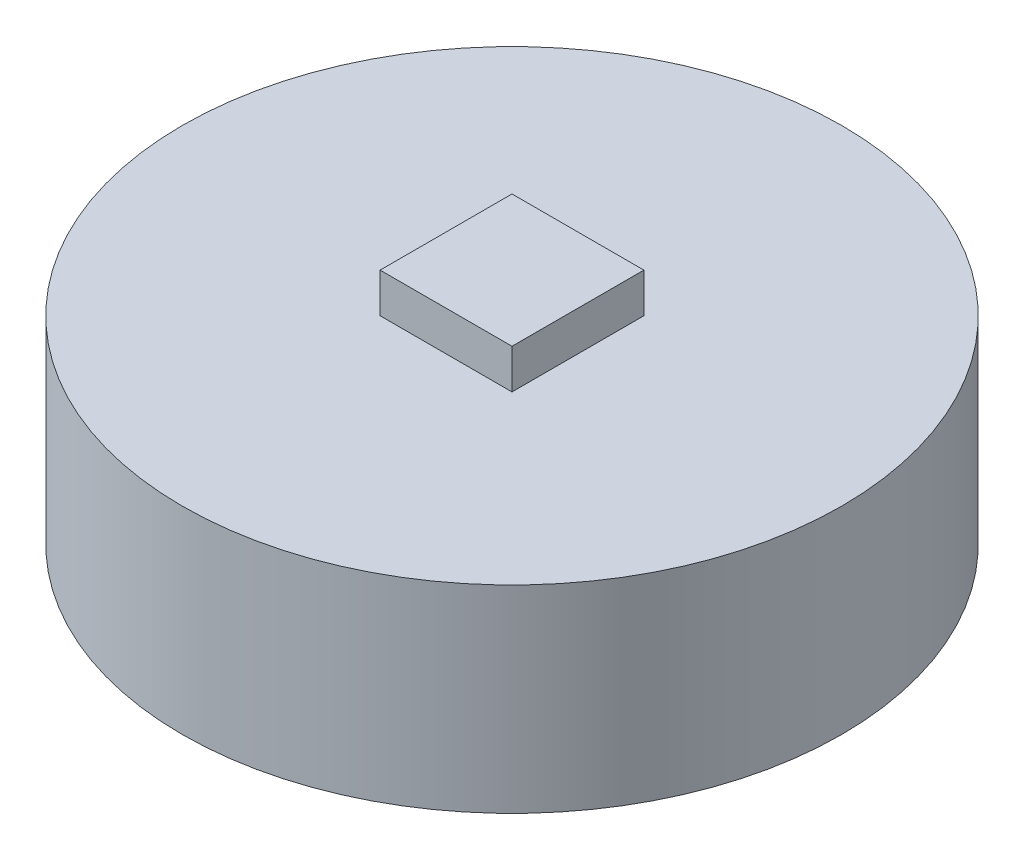
ISO-10303-21;
HEADER;
FILE_DESCRIPTION(('STEP AP214'),'2;1');
FILE_NAME('part.step','',(''),(''),'','','');
FILE_SCHEMA(('AUTOMOTIVE_DESIGN { 1 0 10303 214 1 1 1 1 }'));
ENDSEC;
DATA;
#1=APPLICATION_CONTEXT('core data for automotive mechanical design processes');
#2=APPLICATION_PROTOCOL_DEFINITION('international standard','automotive_design',2000,#1);
#3=PRODUCT_CONTEXT('',#1,'mechanical');
#4=PRODUCT('Part','Part','',(#3));
#5=PRODUCT_RELATED_PRODUCT_CATEGORY('part','',(#4));
#6=PRODUCT_DEFINITION_FORMATION('','',#4);
#7=PRODUCT_DEFINITION_CONTEXT('part definition',#1,'design');
#8=PRODUCT_DEFINITION('design','',#6,#7);
#9=PRODUCT_DEFINITION_SHAPE('','',#8);
#10=(LENGTH_UNIT() NAMED_UNIT(*) SI_UNIT(.MILLI.,.METRE.));
#11=(NAMED_UNIT(*) PLANE_ANGLE_UNIT() SI_UNIT($,.RADIAN.));
#12=(NAMED_UNIT(*) SI_UNIT($,.STERADIAN.) SOLID_ANGLE_UNIT());
#13=UNCERTAINTY_MEASURE_WITH_UNIT(LENGTH_MEASURE(1.E-05),#10,'distance_accuracy_value','');
#14=(GEOMETRIC_REPRESENTATION_CONTEXT(3) GLOBAL_UNCERTAINTY_ASSIGNED_CONTEXT((#13)) GLOBAL_UNIT_ASSIGNED_CONTEXT((#10,
#11,#12)) REPRESENTATION_CONTEXT('',''));
#15=CARTESIAN_POINT('',(0.,0.,0.));
#16=DIRECTION('',(0.,0.,1.));
#17=DIRECTION('',(1.,0.,0.));
#18=AXIS2_PLACEMENT_3D('',#15,#16,#17);
#19=CARTESIAN_POINT('',(0.,15.,0.));
#20=DIRECTION('',(0.,-1.,0.));
#21=DIRECTION('',(0.,0.,-1.));
#22=AXIS2_PLACEMENT_3D('',#19,#20,#21);
#23=CYLINDRICAL_SURFACE('',#22,25.);
#24=CARTESIAN_POINT('',(0.,15.,0.));
#25=DIRECTION('',(0.,1.,0.));
#26=DIRECTION('',(0.,0.,1.));
#27=AXIS2_PLACEMENT_3D('',#24,#25,#26);
#28=CIRCLE('',#27,25.);
#29=CARTESIAN_POINT('',(0.,15.,25.));
#30=VERTEX_POINT('',#29);
#31=EDGE_CURVE('E11',#30,#30,#28,.T.);
#32=ORIENTED_EDGE('',*,*,#31,.F.);
#33=EDGE_LOOP('',(#32));
#34=FACE_BOUND('',#33,.T.);
#35=CARTESIAN_POINT('',(0.,0.,0.));
#36=DIRECTION('',(0.,1.,0.));
#37=DIRECTION('',(0.,0.,1.));
#38=AXIS2_PLACEMENT_3D('',#35,#36,#37);
#39=CIRCLE('',#38,25.);
#40=CARTESIAN_POINT('',(0.,0.,25.));
#41=VERTEX_POINT('',#40);
#42=EDGE_CURVE('E42',#41,#41,#39,.T.);
#43=ORIENTED_EDGE('',*,*,#42,.T.);
#44=EDGE_LOOP('',(#43));
#45=FACE_BOUND('',#44,.T.);
#46=ADVANCED_FACE('F39',(#34,#45),#23,.T.);
#47=CARTESIAN_POINT('',(0.,15.,0.));
#48=DIRECTION('',(0.,1.,0.));
#49=DIRECTION('',(0.,0.,1.));
#50=AXIS2_PLACEMENT_3D('',#47,#48,#49);
#51=PLANE('',#50);
#52=DIRECTION('',(0.,0.,-1.));
#53=VECTOR('',#52,1.);
#54=CARTESIAN_POINT('',(5.,15.,5.));
#55=LINE('',#54,#53);
#56=CARTESIAN_POINT('',(5.,15.,5.));
#57=VERTEX_POINT('',#56);
#58=CARTESIAN_POINT('',(5.,15.,-5.));
#59=VERTEX_POINT('',#58);
#60=EDGE_CURVE('E62',#57,#59,#55,.T.);
#61=ORIENTED_EDGE('',*,*,#60,.F.);
#62=DIRECTION('',(1.,0.,0.));
#63=VECTOR('',#62,1.);
#64=CARTESIAN_POINT('',(-5.,15.,5.));
#65=LINE('',#64,#63);
#66=CARTESIAN_POINT('',(-5.,15.,5.));
#67=VERTEX_POINT('',#66);
#68=EDGE_CURVE('E159',#67,#57,#65,.T.);
#69=ORIENTED_EDGE('',*,*,#68,.F.);
#70=DIRECTION('',(0.,0.,1.));
#71=VECTOR('',#70,1.);
#72=CARTESIAN_POINT('',(-5.,15.,5.));
#73=LINE('',#72,#71);
#74=CARTESIAN_POINT('',(-5.,15.,-5.));
#75=VERTEX_POINT('',#74);
#76=EDGE_CURVE('E175',#75,#67,#73,.T.);
#77=ORIENTED_EDGE('',*,*,#76,.F.);
#78=DIRECTION('',(-1.,0.,0.));
#79=VECTOR('',#78,1.);
#80=CARTESIAN_POINT('',(-5.,15.,-5.));
#81=LINE('',#80,#79);
#82=EDGE_CURVE('E171',#59,#75,#81,.T.);
#83=ORIENTED_EDGE('',*,*,#82,.F.);
#84=EDGE_LOOP('',(#61,#69,#77,#83));
#85=FACE_BOUND('',#84,.T.);
#86=ORIENTED_EDGE('',*,*,#31,.T.);
#87=EDGE_LOOP('',(#86));
#88=FACE_BOUND('',#87,.T.);
#89=ADVANCED_FACE('F205',(#85,#88),#51,.T.);
#90=CARTESIAN_POINT('',(0.,0.,0.));
#91=DIRECTION('',(0.,1.,0.));
#92=DIRECTION('',(0.,0.,1.));
#93=AXIS2_PLACEMENT_3D('',#90,#91,#92);
#94=PLANE('',#93);
#95=DIRECTION('',(1.,0.,0.));
#96=VECTOR('',#95,1.);
#97=CARTESIAN_POINT('',(5.,0.,-5.));
#98=LINE('',#97,#96);
#99=CARTESIAN_POINT('',(-5.,0.,-5.));
#100=VERTEX_POINT('',#99);
#101=CARTESIAN_POINT('',(5.,0.,-5.));
#102=VERTEX_POINT('',#101);
#103=EDGE_CURVE('E140',#100,#102,#98,.T.);
#104=ORIENTED_EDGE('',*,*,#103,.F.);
#105=DIRECTION('',(0.,0.,-1.));
#106=VECTOR('',#105,1.);
#107=CARTESIAN_POINT('',(-5.,0.,5.));
#108=LINE('',#107,#106);
#109=CARTESIAN_POINT('',(-5.,0.,5.));
#110=VERTEX_POINT('',#109);
#111=EDGE_CURVE('E54',#110,#100,#108,.T.);
#112=ORIENTED_EDGE('',*,*,#111,.F.);
#113=DIRECTION('',(-1.,0.,0.));
#114=VECTOR('',#113,1.);
#115=CARTESIAN_POINT('',(5.,0.,5.));
#116=LINE('',#115,#114);
#117=CARTESIAN_POINT('',(5.,0.,5.));
#118=VERTEX_POINT('',#117);
#119=EDGE_CURVE('E127',#118,#110,#116,.T.);
#120=ORIENTED_EDGE('',*,*,#119,.F.);
#121=DIRECTION('',(0.,0.,1.));
#122=VECTOR('',#121,1.);
#123=CARTESIAN_POINT('',(5.,0.,5.));
#124=LINE('',#123,#122);
#125=EDGE_CURVE('E131',#102,#118,#124,.T.);
#126=ORIENTED_EDGE('',*,*,#125,.F.);
#127=EDGE_LOOP('',(#104,#112,#120,#126));
#128=FACE_BOUND('',#127,.T.);
#129=ORIENTED_EDGE('',*,*,#42,.F.);
#130=EDGE_LOOP('',(#129));
#131=FACE_BOUND('',#130,.T.);
#132=ADVANCED_FACE('F202',(#128,#131),#94,.F.);
#133=CARTESIAN_POINT('',(5.,18.,5.));
#134=DIRECTION('',(-1.,0.,0.));
#135=DIRECTION('',(0.,0.,1.));
#136=AXIS2_PLACEMENT_3D('',#133,#134,#135);
#137=PLANE('',#136);
#138=ORIENTED_EDGE('',*,*,#60,.T.);
#139=DIRECTION('',(0.,-1.,0.));
#140=VECTOR('',#139,1.);
#141=CARTESIAN_POINT('',(5.,18.,-5.));
#142=LINE('',#141,#140);
#143=CARTESIAN_POINT('',(5.,18.,-5.));
#144=VERTEX_POINT('',#143);
#145=EDGE_CURVE('E192',#144,#59,#142,.T.);
#146=ORIENTED_EDGE('',*,*,#145,.F.);
#147=DIRECTION('',(0.,0.,-1.));
#148=VECTOR('',#147,1.);
#149=CARTESIAN_POINT('',(5.,18.,5.));
#150=LINE('',#149,#148);
#151=CARTESIAN_POINT('',(5.,18.,5.));
#152=VERTEX_POINT('',#151);
#153=EDGE_CURVE('E154',#152,#144,#150,.T.);
#154=ORIENTED_EDGE('',*,*,#153,.F.);
#155=DIRECTION('',(0.,-1.,0.));
#156=VECTOR('',#155,1.);
#157=CARTESIAN_POINT('',(5.,18.,5.));
#158=LINE('',#157,#156);
#159=EDGE_CURVE('E168',#152,#57,#158,.T.);
#160=ORIENTED_EDGE('',*,*,#159,.T.);
#161=EDGE_LOOP('',(#138,#146,#154,#160));
#162=FACE_BOUND('',#161,.T.);
#163=ADVANCED_FACE('F204',(#162),#137,.F.);
#164=CARTESIAN_POINT('',(-5.,18.,-5.));
#165=DIRECTION('',(0.,0.,1.));
#166=DIRECTION('',(1.,0.,0.));
#167=AXIS2_PLACEMENT_3D('',#164,#165,#166);
#168=PLANE('',#167);
#169=ORIENTED_EDGE('',*,*,#82,.T.);
#170=DIRECTION('',(0.,-1.,0.));
#171=VECTOR('',#170,1.);
#172=CARTESIAN_POINT('',(-5.,18.,-5.));
#173=LINE('',#172,#171);
#174=CARTESIAN_POINT('',(-5.,18.,-5.));
#175=VERTEX_POINT('',#174);
#176=EDGE_CURVE('E188',#175,#75,#173,.T.);
#177=ORIENTED_EDGE('',*,*,#176,.F.);
#178=DIRECTION('',(-1.,0.,0.));
#179=VECTOR('',#178,1.);
#180=CARTESIAN_POINT('',(-5.,18.,-5.));
#181=LINE('',#180,#179);
#182=EDGE_CURVE('E158',#144,#175,#181,.T.);
#183=ORIENTED_EDGE('',*,*,#182,.F.);
#184=ORIENTED_EDGE('',*,*,#145,.T.);
#185=EDGE_LOOP('',(#169,#177,#183,#184));
#186=FACE_BOUND('',#185,.T.);
#187=ADVANCED_FACE('F211',(#186),#168,.F.);
#188=CARTESIAN_POINT('',(-5.,18.,5.));
#189=DIRECTION('',(1.,0.,0.));
#190=DIRECTION('',(0.,0.,-1.));
#191=AXIS2_PLACEMENT_3D('',#188,#189,#190);
#192=PLANE('',#191);
#193=ORIENTED_EDGE('',*,*,#76,.T.);
#194=DIRECTION('',(0.,-1.,0.));
#195=VECTOR('',#194,1.);
#196=CARTESIAN_POINT('',(-5.,18.,5.));
#197=LINE('',#196,#195);
#198=CARTESIAN_POINT('',(-5.,18.,5.));
#199=VERTEX_POINT('',#198);
#200=EDGE_CURVE('E184',#199,#67,#197,.T.);
#201=ORIENTED_EDGE('',*,*,#200,.F.);
#202=DIRECTION('',(0.,0.,1.));
#203=VECTOR('',#202,1.);
#204=CARTESIAN_POINT('',(-5.,18.,5.));
#205=LINE('',#204,#203);
#206=EDGE_CURVE('E162',#175,#199,#205,.T.);
#207=ORIENTED_EDGE('',*,*,#206,.F.);
#208=ORIENTED_EDGE('',*,*,#176,.T.);
#209=EDGE_LOOP('',(#193,#201,#207,#208));
#210=FACE_BOUND('',#209,.T.);
#211=ADVANCED_FACE('F241',(#210),#192,.F.);
#212=CARTESIAN_POINT('',(-5.,18.,5.));
#213=DIRECTION('',(0.,0.,-1.));
#214=DIRECTION('',(-1.,0.,0.));
#215=AXIS2_PLACEMENT_3D('',#212,#213,#214);
#216=PLANE('',#215);
#217=ORIENTED_EDGE('',*,*,#68,.T.);
#218=ORIENTED_EDGE('',*,*,#159,.F.);
#219=DIRECTION('',(1.,0.,0.));
#220=VECTOR('',#219,1.);
#221=CARTESIAN_POINT('',(-5.,18.,5.));
#222=LINE('',#221,#220);
#223=EDGE_CURVE('E165',#199,#152,#222,.T.);
#224=ORIENTED_EDGE('',*,*,#223,.F.);
#225=ORIENTED_EDGE('',*,*,#200,.T.);
#226=EDGE_LOOP('',(#217,#218,#224,#225));
#227=FACE_BOUND('',#226,.T.);
#228=ADVANCED_FACE('F250',(#227),#216,.F.);
#229=CARTESIAN_POINT('',(0.,18.,0.));
#230=DIRECTION('',(0.,-1.,0.));
#231=DIRECTION('',(0.,0.,-1.));
#232=AXIS2_PLACEMENT_3D('',#229,#230,#231);
#233=PLANE('',#232);
#234=ORIENTED_EDGE('',*,*,#153,.T.);
#235=ORIENTED_EDGE('',*,*,#182,.T.);
#236=ORIENTED_EDGE('',*,*,#206,.T.);
#237=ORIENTED_EDGE('',*,*,#223,.T.);
#238=EDGE_LOOP('',(#234,#235,#236,#237));
#239=FACE_BOUND('',#238,.T.);
#240=ADVANCED_FACE('F260',(#239),#233,.F.);
#241=CARTESIAN_POINT('',(-5.,3.,5.));
#242=DIRECTION('',(-1.,0.,0.));
#243=DIRECTION('',(0.,0.,1.));
#244=AXIS2_PLACEMENT_3D('',#241,#242,#243);
#245=PLANE('',#244);
#246=ORIENTED_EDGE('',*,*,#111,.T.);
#247=DIRECTION('',(0.,-1.,0.));
#248=VECTOR('',#247,1.);
#249=CARTESIAN_POINT('',(-5.,3.,-5.));
#250=LINE('',#249,#248);
#251=CARTESIAN_POINT('',(-5.,3.,-5.));
#252=VERTEX_POINT('',#251);
#253=EDGE_CURVE('E102',#252,#100,#250,.T.);
#254=ORIENTED_EDGE('',*,*,#253,.F.);
#255=DIRECTION('',(0.,0.,-1.));
#256=VECTOR('',#255,1.);
#257=CARTESIAN_POINT('',(-5.,3.,5.));
#258=LINE('',#257,#256);
#259=CARTESIAN_POINT('',(-5.,3.,5.));
#260=VERTEX_POINT('',#259);
#261=EDGE_CURVE('E106',#260,#252,#258,.T.);
#262=ORIENTED_EDGE('',*,*,#261,.F.);
#263=DIRECTION('',(0.,-1.,0.));
#264=VECTOR('',#263,1.);
#265=CARTESIAN_POINT('',(-5.,3.,5.));
#266=LINE('',#265,#264);
#267=EDGE_CURVE('E146',#260,#110,#266,.T.);
#268=ORIENTED_EDGE('',*,*,#267,.T.);
#269=EDGE_LOOP('',(#246,#254,#262,#268));
#270=FACE_BOUND('',#269,.T.);
#271=ADVANCED_FACE('F104',(#270),#245,.F.);
#272=CARTESIAN_POINT('',(5.,3.,5.));
#273=DIRECTION('',(0.,0.,1.));
#274=DIRECTION('',(1.,0.,0.));
#275=AXIS2_PLACEMENT_3D('',#272,#273,#274);
#276=PLANE('',#275);
#277=ORIENTED_EDGE('',*,*,#119,.T.);
#278=ORIENTED_EDGE('',*,*,#267,.F.);
#279=DIRECTION('',(-1.,0.,0.));
#280=VECTOR('',#279,1.);
#281=CARTESIAN_POINT('',(5.,3.,5.));
#282=LINE('',#281,#280);
#283=CARTESIAN_POINT('',(5.,3.,5.));
#284=VERTEX_POINT('',#283);
#285=EDGE_CURVE('E113',#284,#260,#282,.T.);
#286=ORIENTED_EDGE('',*,*,#285,.F.);
#287=DIRECTION('',(0.,-1.,0.));
#288=VECTOR('',#287,1.);
#289=CARTESIAN_POINT('',(5.,3.,5.));
#290=LINE('',#289,#288);
#291=EDGE_CURVE('E149',#284,#118,#290,.T.);
#292=ORIENTED_EDGE('',*,*,#291,.T.);
#293=EDGE_LOOP('',(#277,#278,#286,#292));
#294=FACE_BOUND('',#293,.T.);
#295=ADVANCED_FACE('F282',(#294),#276,.F.);
#296=CARTESIAN_POINT('',(5.,3.,5.));
#297=DIRECTION('',(1.,0.,0.));
#298=DIRECTION('',(0.,0.,-1.));
#299=AXIS2_PLACEMENT_3D('',#296,#297,#298);
#300=PLANE('',#299);
#301=ORIENTED_EDGE('',*,*,#125,.T.);
#302=ORIENTED_EDGE('',*,*,#291,.F.);
#303=DIRECTION('',(0.,0.,1.));
#304=VECTOR('',#303,1.);
#305=CARTESIAN_POINT('',(5.,3.,5.));
#306=LINE('',#305,#304);
#307=CARTESIAN_POINT('',(5.,3.,-5.));
#308=VERTEX_POINT('',#307);
#309=EDGE_CURVE('E122',#308,#284,#306,.T.);
#310=ORIENTED_EDGE('',*,*,#309,.F.);
#311=DIRECTION('',(0.,-1.,0.));
#312=VECTOR('',#311,1.);
#313=CARTESIAN_POINT('',(5.,3.,-5.));
#314=LINE('',#313,#312);
#315=EDGE_CURVE('E112',#308,#102,#314,.T.);
#316=ORIENTED_EDGE('',*,*,#315,.T.);
#317=EDGE_LOOP('',(#301,#302,#310,#316));
#318=FACE_BOUND('',#317,.T.);
#319=ADVANCED_FACE('F291',(#318),#300,.F.);
#320=CARTESIAN_POINT('',(5.,3.,-5.));
#321=DIRECTION('',(0.,0.,-1.));
#322=DIRECTION('',(-1.,0.,0.));
#323=AXIS2_PLACEMENT_3D('',#320,#321,#322);
#324=PLANE('',#323);
#325=ORIENTED_EDGE('',*,*,#103,.T.);
#326=ORIENTED_EDGE('',*,*,#315,.F.);
#327=DIRECTION('',(1.,0.,0.));
#328=VECTOR('',#327,1.);
#329=CARTESIAN_POINT('',(5.,3.,-5.));
#330=LINE('',#329,#328);
#331=EDGE_CURVE('E116',#252,#308,#330,.T.);
#332=ORIENTED_EDGE('',*,*,#331,.F.);
#333=ORIENTED_EDGE('',*,*,#253,.T.);
#334=EDGE_LOOP('',(#325,#326,#332,#333));
#335=FACE_BOUND('',#334,.T.);
#336=ADVANCED_FACE('F117',(#335),#324,.F.);
#337=CARTESIAN_POINT('',(0.,3.,0.));
#338=DIRECTION('',(0.,1.,0.));
#339=DIRECTION('',(0.,0.,1.));
#340=AXIS2_PLACEMENT_3D('',#337,#338,#339);
#341=PLANE('',#340);
#342=ORIENTED_EDGE('',*,*,#261,.T.);
#343=ORIENTED_EDGE('',*,*,#331,.T.);
#344=ORIENTED_EDGE('',*,*,#309,.T.);
#345=ORIENTED_EDGE('',*,*,#285,.T.);
#346=EDGE_LOOP('',(#342,#343,#344,#345));
#347=FACE_BOUND('',#346,.T.);
#348=ADVANCED_FACE('F124',(#347),#341,.F.);
#349=CLOSED_SHELL('',(#46,#89,#132,#163,#187,#211,#228,#240,#271,#295,#319,#336,#348));
#350=MANIFOLD_SOLID_BREP('B2',#349);
#351=ADVANCED_BREP_SHAPE_REPRESENTATION('',(#18,#350),#14);
#352=SHAPE_DEFINITION_REPRESENTATION(#9,#351);
ENDSEC;
END-ISO-10303-21;
